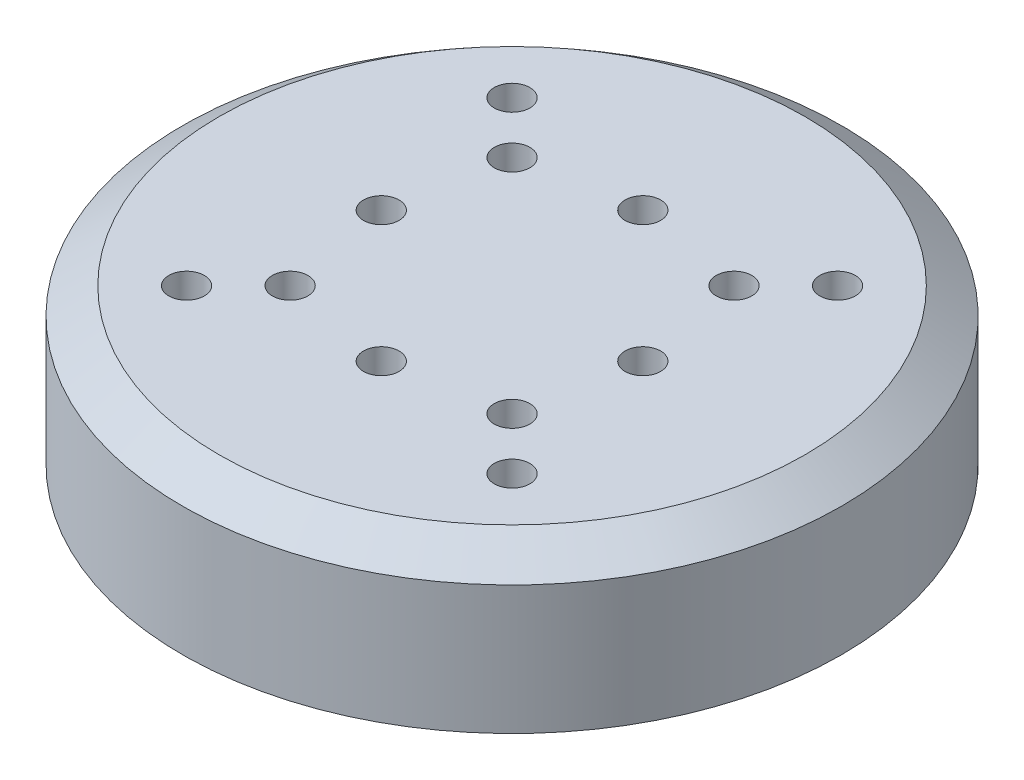
ISO-10303-21;
HEADER;
FILE_DESCRIPTION(('STEP AP214'),'2;1');
FILE_NAME('part.step','',(''),(''),'','','');
FILE_SCHEMA(('AUTOMOTIVE_DESIGN { 1 0 10303 214 1 1 1 1 }'));
ENDSEC;
DATA;
#1=APPLICATION_CONTEXT('core data for automotive mechanical design processes');
#2=APPLICATION_PROTOCOL_DEFINITION('international standard','automotive_design',2000,#1);
#3=PRODUCT_CONTEXT('',#1,'mechanical');
#4=PRODUCT('Part','Part','',(#3));
#5=PRODUCT_RELATED_PRODUCT_CATEGORY('part','',(#4));
#6=PRODUCT_DEFINITION_FORMATION('','',#4);
#7=PRODUCT_DEFINITION_CONTEXT('part definition',#1,'design');
#8=PRODUCT_DEFINITION('design','',#6,#7);
#9=PRODUCT_DEFINITION_SHAPE('','',#8);
#10=(LENGTH_UNIT() NAMED_UNIT(*) SI_UNIT(.MILLI.,.METRE.));
#11=(NAMED_UNIT(*) PLANE_ANGLE_UNIT() SI_UNIT($,.RADIAN.));
#12=(NAMED_UNIT(*) SI_UNIT($,.STERADIAN.) SOLID_ANGLE_UNIT());
#13=UNCERTAINTY_MEASURE_WITH_UNIT(LENGTH_MEASURE(1.E-05),#10,'distance_accuracy_value','');
#14=(GEOMETRIC_REPRESENTATION_CONTEXT(3) GLOBAL_UNCERTAINTY_ASSIGNED_CONTEXT((#13)) GLOBAL_UNIT_ASSIGNED_CONTEXT((#10,
#11,#12)) REPRESENTATION_CONTEXT('',''));
#15=CARTESIAN_POINT('',(0.,0.,0.));
#16=DIRECTION('',(0.,0.,1.));
#17=DIRECTION('',(1.,0.,0.));
#18=AXIS2_PLACEMENT_3D('',#15,#16,#17);
#19=CARTESIAN_POINT('',(-31.5,-7.40000000000001,0.));
#20=DIRECTION('',(0.,1.,0.));
#21=DIRECTION('',(-1.,0.,0.));
#22=AXIS2_PLACEMENT_3D('',#19,#20,#21);
#23=PLANE('',#22);
#24=CARTESIAN_POINT('',(0.,-7.4,0.));
#25=DIRECTION('',(0.,-1.,0.));
#26=DIRECTION('',(1.,0.,0.));
#27=AXIS2_PLACEMENT_3D('',#24,#25,#26);
#28=CIRCLE('',#27,29.5);
#29=CARTESIAN_POINT('',(29.5,-7.4,0.));
#30=VERTEX_POINT('',#29);
#31=EDGE_CURVE('E284',#30,#30,#28,.T.);
#32=ORIENTED_EDGE('',*,*,#31,.F.);
#33=EDGE_LOOP('',(#32));
#34=FACE_BOUND('',#33,.T.);
#35=CARTESIAN_POINT('',(0.,-7.4,0.));
#36=DIRECTION('',(0.,-1.,0.));
#37=DIRECTION('',(1.,0.,0.));
#38=AXIS2_PLACEMENT_3D('',#35,#36,#37);
#39=CIRCLE('',#38,31.5);
#40=CARTESIAN_POINT('',(31.5,-7.39999999999999,0.));
#41=VERTEX_POINT('',#40);
#42=EDGE_CURVE('E160',#41,#41,#39,.T.);
#43=ORIENTED_EDGE('',*,*,#42,.T.);
#44=EDGE_LOOP('',(#43));
#45=FACE_BOUND('',#44,.T.);
#46=ADVANCED_FACE('F33',(#34,#45),#23,.F.);
#47=CARTESIAN_POINT('',(0.,7.4,0.));
#48=DIRECTION('',(0.,-1.,0.));
#49=DIRECTION('',(1.,0.,0.));
#50=AXIS2_PLACEMENT_3D('',#47,#48,#49);
#51=PLANE('',#50);
#52=CARTESIAN_POINT('',(-15.556349186104,7.4,-15.5563491861041));
#53=DIRECTION('',(0.,1.,0.));
#54=DIRECTION('',(0.,0.,1.));
#55=AXIS2_PLACEMENT_3D('',#52,#53,#54);
#56=CIRCLE('',#55,1.69999999999999);
#57=CARTESIAN_POINT('',(-15.556349186104,7.4,-13.8563491861041));
#58=VERTEX_POINT('',#57);
#59=EDGE_CURVE('E88',#58,#58,#56,.T.);
#60=ORIENTED_EDGE('',*,*,#59,.F.);
#61=EDGE_LOOP('',(#60));
#62=FACE_BOUND('',#61,.T.);
#63=CARTESIAN_POINT('',(-10.6066017177982,7.4,-10.6066017177983));
#64=DIRECTION('',(0.,1.,0.));
#65=DIRECTION('',(0.,0.,1.));
#66=AXIS2_PLACEMENT_3D('',#63,#64,#65);
#67=CIRCLE('',#66,1.69999999999999);
#68=CARTESIAN_POINT('',(-10.6066017177982,7.4,-8.90660171779828));
#69=VERTEX_POINT('',#68);
#70=EDGE_CURVE('E87',#69,#69,#67,.T.);
#71=ORIENTED_EDGE('',*,*,#70,.F.);
#72=EDGE_LOOP('',(#71));
#73=FACE_BOUND('',#72,.T.);
#74=CARTESIAN_POINT('',(0.,7.4,-12.5));
#75=DIRECTION('',(0.,1.,0.));
#76=DIRECTION('',(0.,0.,1.));
#77=AXIS2_PLACEMENT_3D('',#74,#75,#76);
#78=CIRCLE('',#77,1.69999999999999);
#79=CARTESIAN_POINT('',(0.,7.4,-10.8));
#80=VERTEX_POINT('',#79);
#81=EDGE_CURVE('E100',#80,#80,#78,.T.);
#82=ORIENTED_EDGE('',*,*,#81,.F.);
#83=EDGE_LOOP('',(#82));
#84=FACE_BOUND('',#83,.T.);
#85=CARTESIAN_POINT('',(10.6066017177983,7.40000000000001,-10.6066017177982));
#86=DIRECTION('',(0.,1.,0.));
#87=DIRECTION('',(0.,0.,1.));
#88=AXIS2_PLACEMENT_3D('',#85,#86,#87);
#89=CIRCLE('',#88,1.69999999999999);
#90=CARTESIAN_POINT('',(10.6066017177983,7.40000000000001,-8.90660171779817));
#91=VERTEX_POINT('',#90);
#92=EDGE_CURVE('E106',#91,#91,#89,.T.);
#93=ORIENTED_EDGE('',*,*,#92,.F.);
#94=EDGE_LOOP('',(#93));
#95=FACE_BOUND('',#94,.T.);
#96=CARTESIAN_POINT('',(15.5563491861041,7.40000000000001,-15.556349186104));
#97=DIRECTION('',(0.,1.,0.));
#98=DIRECTION('',(0.,0.,1.));
#99=AXIS2_PLACEMENT_3D('',#96,#97,#98);
#100=CIRCLE('',#99,1.69999999999999);
#101=CARTESIAN_POINT('',(15.5563491861041,7.40000000000001,-13.856349186104));
#102=VERTEX_POINT('',#101);
#103=EDGE_CURVE('E112',#102,#102,#100,.T.);
#104=ORIENTED_EDGE('',*,*,#103,.F.);
#105=EDGE_LOOP('',(#104));
#106=FACE_BOUND('',#105,.T.);
#107=CARTESIAN_POINT('',(0.,7.4,12.5));
#108=DIRECTION('',(0.,1.,0.));
#109=DIRECTION('',(0.,0.,1.));
#110=AXIS2_PLACEMENT_3D('',#107,#108,#109);
#111=CIRCLE('',#110,1.69999999999999);
#112=CARTESIAN_POINT('',(0.,7.4,14.2));
#113=VERTEX_POINT('',#112);
#114=EDGE_CURVE('E118',#113,#113,#111,.T.);
#115=ORIENTED_EDGE('',*,*,#114,.F.);
#116=EDGE_LOOP('',(#115));
#117=FACE_BOUND('',#116,.T.);
#118=CARTESIAN_POINT('',(-12.5,7.4,0.));
#119=DIRECTION('',(0.,1.,0.));
#120=DIRECTION('',(0.,0.,1.));
#121=AXIS2_PLACEMENT_3D('',#118,#119,#120);
#122=CIRCLE('',#121,1.69999999999999);
#123=CARTESIAN_POINT('',(-12.5,7.4,1.69999999999999));
#124=VERTEX_POINT('',#123);
#125=EDGE_CURVE('E124',#124,#124,#122,.T.);
#126=ORIENTED_EDGE('',*,*,#125,.F.);
#127=EDGE_LOOP('',(#126));
#128=FACE_BOUND('',#127,.T.);
#129=CARTESIAN_POINT('',(12.5,7.40000000000001,0.));
#130=DIRECTION('',(0.,1.,0.));
#131=DIRECTION('',(0.,0.,1.));
#132=AXIS2_PLACEMENT_3D('',#129,#130,#131);
#133=CIRCLE('',#132,1.69999999999999);
#134=CARTESIAN_POINT('',(12.5,7.40000000000001,1.69999999999999));
#135=VERTEX_POINT('',#134);
#136=EDGE_CURVE('E130',#135,#135,#133,.T.);
#137=ORIENTED_EDGE('',*,*,#136,.F.);
#138=EDGE_LOOP('',(#137));
#139=FACE_BOUND('',#138,.T.);
#140=CARTESIAN_POINT('',(10.6066017177982,7.40000000000001,10.6066017177983));
#141=DIRECTION('',(0.,1.,0.));
#142=DIRECTION('',(0.,0.,1.));
#143=AXIS2_PLACEMENT_3D('',#140,#141,#142);
#144=CIRCLE('',#143,1.69999999999999);
#145=CARTESIAN_POINT('',(10.6066017177982,7.40000000000001,12.3066017177983));
#146=VERTEX_POINT('',#145);
#147=EDGE_CURVE('E136',#146,#146,#144,.T.);
#148=ORIENTED_EDGE('',*,*,#147,.F.);
#149=EDGE_LOOP('',(#148));
#150=FACE_BOUND('',#149,.T.);
#151=CARTESIAN_POINT('',(-10.6066017177983,7.4,10.6066017177982));
#152=DIRECTION('',(0.,1.,0.));
#153=DIRECTION('',(0.,0.,1.));
#154=AXIS2_PLACEMENT_3D('',#151,#152,#153);
#155=CIRCLE('',#154,1.69999999999999);
#156=CARTESIAN_POINT('',(-10.6066017177983,7.4,12.3066017177981));
#157=VERTEX_POINT('',#156);
#158=EDGE_CURVE('E142',#157,#157,#155,.T.);
#159=ORIENTED_EDGE('',*,*,#158,.F.);
#160=EDGE_LOOP('',(#159));
#161=FACE_BOUND('',#160,.T.);
#162=CARTESIAN_POINT('',(-15.5563491861041,7.4,15.556349186104));
#163=DIRECTION('',(0.,1.,0.));
#164=DIRECTION('',(0.,0.,1.));
#165=AXIS2_PLACEMENT_3D('',#162,#163,#164);
#166=CIRCLE('',#165,1.69999999999999);
#167=CARTESIAN_POINT('',(-15.5563491861041,7.4,17.256349186104));
#168=VERTEX_POINT('',#167);
#169=EDGE_CURVE('E148',#168,#168,#166,.T.);
#170=ORIENTED_EDGE('',*,*,#169,.F.);
#171=EDGE_LOOP('',(#170));
#172=FACE_BOUND('',#171,.T.);
#173=CARTESIAN_POINT('',(15.556349186104,7.40000000000001,15.5563491861041));
#174=DIRECTION('',(0.,1.,0.));
#175=DIRECTION('',(0.,0.,1.));
#176=AXIS2_PLACEMENT_3D('',#173,#174,#175);
#177=CIRCLE('',#176,1.69999999999999);
#178=CARTESIAN_POINT('',(15.556349186104,7.40000000000001,17.2563491861041));
#179=VERTEX_POINT('',#178);
#180=EDGE_CURVE('E154',#179,#179,#177,.T.);
#181=ORIENTED_EDGE('',*,*,#180,.F.);
#182=EDGE_LOOP('',(#181));
#183=FACE_BOUND('',#182,.T.);
#184=CARTESIAN_POINT('',(0.,7.4,0.));
#185=DIRECTION('',(0.,-1.,0.));
#186=DIRECTION('',(1.,0.,0.));
#187=AXIS2_PLACEMENT_3D('',#184,#185,#186);
#188=CIRCLE('',#187,28.);
#189=CARTESIAN_POINT('',(28.,7.4,0.));
#190=VERTEX_POINT('',#189);
#191=EDGE_CURVE('E11',#190,#190,#188,.T.);
#192=ORIENTED_EDGE('',*,*,#191,.F.);
#193=EDGE_LOOP('',(#192));
#194=FACE_BOUND('',#193,.T.);
#195=ADVANCED_FACE('F170',(#62,#73,#84,#95,#106,#117,#128,#139,#150,#161,#172,#183,#194),#51,.F.);
#196=CARTESIAN_POINT('',(0.,7.4,0.));
#197=DIRECTION('',(0.,-1.,0.));
#198=DIRECTION('',(1.,0.,0.));
#199=AXIS2_PLACEMENT_3D('',#196,#197,#198);
#200=CONICAL_SURFACE('',#199,28.,0.950546840812075);
#201=CARTESIAN_POINT('',(0.,4.9,0.));
#202=DIRECTION('',(0.,-1.,0.));
#203=DIRECTION('',(1.,0.,0.));
#204=AXIS2_PLACEMENT_3D('',#201,#202,#203);
#205=CIRCLE('',#204,31.5);
#206=CARTESIAN_POINT('',(31.5,4.90000000000001,0.));
#207=VERTEX_POINT('',#206);
#208=EDGE_CURVE('E40',#207,#207,#205,.T.);
#209=ORIENTED_EDGE('',*,*,#208,.F.);
#210=EDGE_LOOP('',(#209));
#211=FACE_BOUND('',#210,.T.);
#212=ORIENTED_EDGE('',*,*,#191,.T.);
#213=EDGE_LOOP('',(#212));
#214=FACE_BOUND('',#213,.T.);
#215=ADVANCED_FACE('F167',(#211,#214),#200,.T.);
#216=CARTESIAN_POINT('',(0.,-7.40000000000001,0.));
#217=DIRECTION('',(0.,-1.,0.));
#218=DIRECTION('',(1.,0.,0.));
#219=AXIS2_PLACEMENT_3D('',#216,#217,#218);
#220=CYLINDRICAL_SURFACE('',#219,31.5);
#221=ORIENTED_EDGE('',*,*,#42,.F.);
#222=EDGE_LOOP('',(#221));
#223=FACE_BOUND('',#222,.T.);
#224=ORIENTED_EDGE('',*,*,#208,.T.);
#225=EDGE_LOOP('',(#224));
#226=FACE_BOUND('',#225,.T.);
#227=ADVANCED_FACE('F165',(#223,#226),#220,.T.);
#228=CARTESIAN_POINT('',(15.556349186104,3.4,15.5563491861041));
#229=DIRECTION('',(0.,1.,0.));
#230=DIRECTION('',(0.,0.,1.));
#231=AXIS2_PLACEMENT_3D('',#228,#229,#230);
#232=CONICAL_SURFACE('',#231,1.69999999999999,1.02974425867665);
#233=CARTESIAN_POINT('',(15.556349186104,2.37853694765315,15.5563491861041));
#234=VERTEX_POINT('',#233);
#235=VERTEX_LOOP('',#234);
#236=FACE_BOUND('',#235,.T.);
#237=CARTESIAN_POINT('',(15.556349186104,3.4,15.5563491861041));
#238=DIRECTION('',(0.,1.,0.));
#239=DIRECTION('',(0.,0.,1.));
#240=AXIS2_PLACEMENT_3D('',#237,#238,#239);
#241=CIRCLE('',#240,1.69999999999999);
#242=CARTESIAN_POINT('',(15.556349186104,3.4,17.2563491861041));
#243=VERTEX_POINT('',#242);
#244=EDGE_CURVE('E157',#243,#243,#241,.T.);
#245=ORIENTED_EDGE('',*,*,#244,.T.);
#246=EDGE_LOOP('',(#245));
#247=FACE_BOUND('',#246,.T.);
#248=ADVANCED_FACE('F185',(#236,#247),#232,.F.);
#249=CARTESIAN_POINT('',(15.556349186104,7.40000000000001,15.5563491861041));
#250=DIRECTION('',(0.,1.,0.));
#251=DIRECTION('',(0.,0.,1.));
#252=AXIS2_PLACEMENT_3D('',#249,#250,#251);
#253=CYLINDRICAL_SURFACE('',#252,1.69999999999999);
#254=ORIENTED_EDGE('',*,*,#244,.F.);
#255=EDGE_LOOP('',(#254));
#256=FACE_BOUND('',#255,.T.);
#257=ORIENTED_EDGE('',*,*,#180,.T.);
#258=EDGE_LOOP('',(#257));
#259=FACE_BOUND('',#258,.T.);
#260=ADVANCED_FACE('F189',(#256,#259),#253,.F.);
#261=CARTESIAN_POINT('',(-15.5563491861041,3.4,15.556349186104));
#262=DIRECTION('',(0.,1.,0.));
#263=DIRECTION('',(0.,0.,1.));
#264=AXIS2_PLACEMENT_3D('',#261,#262,#263);
#265=CONICAL_SURFACE('',#264,1.69999999999999,1.02974425867665);
#266=CARTESIAN_POINT('',(-15.5563491861041,2.37853694765315,15.556349186104));
#267=VERTEX_POINT('',#266);
#268=VERTEX_LOOP('',#267);
#269=FACE_BOUND('',#268,.T.);
#270=CARTESIAN_POINT('',(-15.5563491861041,3.4,15.556349186104));
#271=DIRECTION('',(0.,1.,0.));
#272=DIRECTION('',(0.,0.,1.));
#273=AXIS2_PLACEMENT_3D('',#270,#271,#272);
#274=CIRCLE('',#273,1.69999999999999);
#275=CARTESIAN_POINT('',(-15.5563491861041,3.4,17.256349186104));
#276=VERTEX_POINT('',#275);
#277=EDGE_CURVE('E151',#276,#276,#274,.T.);
#278=ORIENTED_EDGE('',*,*,#277,.T.);
#279=EDGE_LOOP('',(#278));
#280=FACE_BOUND('',#279,.T.);
#281=ADVANCED_FACE('F192',(#269,#280),#265,.F.);
#282=CARTESIAN_POINT('',(-15.5563491861041,7.4,15.556349186104));
#283=DIRECTION('',(0.,1.,0.));
#284=DIRECTION('',(0.,0.,1.));
#285=AXIS2_PLACEMENT_3D('',#282,#283,#284);
#286=CYLINDRICAL_SURFACE('',#285,1.69999999999999);
#287=ORIENTED_EDGE('',*,*,#277,.F.);
#288=EDGE_LOOP('',(#287));
#289=FACE_BOUND('',#288,.T.);
#290=ORIENTED_EDGE('',*,*,#169,.T.);
#291=EDGE_LOOP('',(#290));
#292=FACE_BOUND('',#291,.T.);
#293=ADVANCED_FACE('F196',(#289,#292),#286,.F.);
#294=CARTESIAN_POINT('',(-10.6066017177983,3.4,10.6066017177982));
#295=DIRECTION('',(0.,1.,0.));
#296=DIRECTION('',(0.,0.,1.));
#297=AXIS2_PLACEMENT_3D('',#294,#295,#296);
#298=CONICAL_SURFACE('',#297,1.69999999999999,1.02974425867665);
#299=CARTESIAN_POINT('',(-10.6066017177983,2.37853694765315,10.6066017177982));
#300=VERTEX_POINT('',#299);
#301=VERTEX_LOOP('',#300);
#302=FACE_BOUND('',#301,.T.);
#303=CARTESIAN_POINT('',(-10.6066017177983,3.4,10.6066017177982));
#304=DIRECTION('',(0.,1.,0.));
#305=DIRECTION('',(0.,0.,1.));
#306=AXIS2_PLACEMENT_3D('',#303,#304,#305);
#307=CIRCLE('',#306,1.69999999999999);
#308=CARTESIAN_POINT('',(-10.6066017177983,3.4,12.3066017177981));
#309=VERTEX_POINT('',#308);
#310=EDGE_CURVE('E145',#309,#309,#307,.T.);
#311=ORIENTED_EDGE('',*,*,#310,.T.);
#312=EDGE_LOOP('',(#311));
#313=FACE_BOUND('',#312,.T.);
#314=ADVANCED_FACE('F199',(#302,#313),#298,.F.);
#315=CARTESIAN_POINT('',(-10.6066017177983,7.4,10.6066017177982));
#316=DIRECTION('',(0.,1.,0.));
#317=DIRECTION('',(0.,0.,1.));
#318=AXIS2_PLACEMENT_3D('',#315,#316,#317);
#319=CYLINDRICAL_SURFACE('',#318,1.69999999999999);
#320=ORIENTED_EDGE('',*,*,#310,.F.);
#321=EDGE_LOOP('',(#320));
#322=FACE_BOUND('',#321,.T.);
#323=ORIENTED_EDGE('',*,*,#158,.T.);
#324=EDGE_LOOP('',(#323));
#325=FACE_BOUND('',#324,.T.);
#326=ADVANCED_FACE('F203',(#322,#325),#319,.F.);
#327=CARTESIAN_POINT('',(10.6066017177982,3.4,10.6066017177983));
#328=DIRECTION('',(0.,1.,0.));
#329=DIRECTION('',(0.,0.,1.));
#330=AXIS2_PLACEMENT_3D('',#327,#328,#329);
#331=CONICAL_SURFACE('',#330,1.69999999999999,1.02974425867665);
#332=CARTESIAN_POINT('',(10.6066017177982,2.37853694765315,10.6066017177983));
#333=VERTEX_POINT('',#332);
#334=VERTEX_LOOP('',#333);
#335=FACE_BOUND('',#334,.T.);
#336=CARTESIAN_POINT('',(10.6066017177982,3.4,10.6066017177983));
#337=DIRECTION('',(0.,1.,0.));
#338=DIRECTION('',(0.,0.,1.));
#339=AXIS2_PLACEMENT_3D('',#336,#337,#338);
#340=CIRCLE('',#339,1.69999999999999);
#341=CARTESIAN_POINT('',(10.6066017177982,3.4,12.3066017177983));
#342=VERTEX_POINT('',#341);
#343=EDGE_CURVE('E139',#342,#342,#340,.T.);
#344=ORIENTED_EDGE('',*,*,#343,.T.);
#345=EDGE_LOOP('',(#344));
#346=FACE_BOUND('',#345,.T.);
#347=ADVANCED_FACE('F207',(#335,#346),#331,.F.);
#348=CARTESIAN_POINT('',(10.6066017177982,7.4,10.6066017177983));
#349=DIRECTION('',(0.,1.,0.));
#350=DIRECTION('',(0.,0.,1.));
#351=AXIS2_PLACEMENT_3D('',#348,#349,#350);
#352=CYLINDRICAL_SURFACE('',#351,1.69999999999999);
#353=ORIENTED_EDGE('',*,*,#343,.F.);
#354=EDGE_LOOP('',(#353));
#355=FACE_BOUND('',#354,.T.);
#356=ORIENTED_EDGE('',*,*,#147,.T.);
#357=EDGE_LOOP('',(#356));
#358=FACE_BOUND('',#357,.T.);
#359=ADVANCED_FACE('F211',(#355,#358),#352,.F.);
#360=CARTESIAN_POINT('',(12.5,3.4,0.));
#361=DIRECTION('',(0.,1.,0.));
#362=DIRECTION('',(0.,0.,1.));
#363=AXIS2_PLACEMENT_3D('',#360,#361,#362);
#364=CONICAL_SURFACE('',#363,1.69999999999999,1.02974425867665);
#365=CARTESIAN_POINT('',(12.5,2.37853694765315,0.));
#366=VERTEX_POINT('',#365);
#367=VERTEX_LOOP('',#366);
#368=FACE_BOUND('',#367,.T.);
#369=CARTESIAN_POINT('',(12.5,3.4,0.));
#370=DIRECTION('',(0.,1.,0.));
#371=DIRECTION('',(0.,0.,1.));
#372=AXIS2_PLACEMENT_3D('',#369,#370,#371);
#373=CIRCLE('',#372,1.69999999999999);
#374=CARTESIAN_POINT('',(12.5,3.4,1.69999999999999));
#375=VERTEX_POINT('',#374);
#376=EDGE_CURVE('E133',#375,#375,#373,.T.);
#377=ORIENTED_EDGE('',*,*,#376,.T.);
#378=EDGE_LOOP('',(#377));
#379=FACE_BOUND('',#378,.T.);
#380=ADVANCED_FACE('F215',(#368,#379),#364,.F.);
#381=CARTESIAN_POINT('',(12.5,7.40000000000001,0.));
#382=DIRECTION('',(0.,1.,0.));
#383=DIRECTION('',(0.,0.,1.));
#384=AXIS2_PLACEMENT_3D('',#381,#382,#383);
#385=CYLINDRICAL_SURFACE('',#384,1.69999999999999);
#386=ORIENTED_EDGE('',*,*,#376,.F.);
#387=EDGE_LOOP('',(#386));
#388=FACE_BOUND('',#387,.T.);
#389=ORIENTED_EDGE('',*,*,#136,.T.);
#390=EDGE_LOOP('',(#389));
#391=FACE_BOUND('',#390,.T.);
#392=ADVANCED_FACE('F219',(#388,#391),#385,.F.);
#393=CARTESIAN_POINT('',(-12.5,3.4,0.));
#394=DIRECTION('',(0.,1.,0.));
#395=DIRECTION('',(0.,0.,1.));
#396=AXIS2_PLACEMENT_3D('',#393,#394,#395);
#397=CONICAL_SURFACE('',#396,1.69999999999999,1.02974425867665);
#398=CARTESIAN_POINT('',(-12.5,2.37853694765315,0.));
#399=VERTEX_POINT('',#398);
#400=VERTEX_LOOP('',#399);
#401=FACE_BOUND('',#400,.T.);
#402=CARTESIAN_POINT('',(-12.5,3.4,0.));
#403=DIRECTION('',(0.,1.,0.));
#404=DIRECTION('',(0.,0.,1.));
#405=AXIS2_PLACEMENT_3D('',#402,#403,#404);
#406=CIRCLE('',#405,1.69999999999999);
#407=CARTESIAN_POINT('',(-12.5,3.4,1.69999999999999));
#408=VERTEX_POINT('',#407);
#409=EDGE_CURVE('E127',#408,#408,#406,.T.);
#410=ORIENTED_EDGE('',*,*,#409,.T.);
#411=EDGE_LOOP('',(#410));
#412=FACE_BOUND('',#411,.T.);
#413=ADVANCED_FACE('F223',(#401,#412),#397,.F.);
#414=CARTESIAN_POINT('',(-12.5,7.4,0.));
#415=DIRECTION('',(0.,1.,0.));
#416=DIRECTION('',(0.,0.,1.));
#417=AXIS2_PLACEMENT_3D('',#414,#415,#416);
#418=CYLINDRICAL_SURFACE('',#417,1.69999999999999);
#419=ORIENTED_EDGE('',*,*,#409,.F.);
#420=EDGE_LOOP('',(#419));
#421=FACE_BOUND('',#420,.T.);
#422=ORIENTED_EDGE('',*,*,#125,.T.);
#423=EDGE_LOOP('',(#422));
#424=FACE_BOUND('',#423,.T.);
#425=ADVANCED_FACE('F227',(#421,#424),#418,.F.);
#426=CARTESIAN_POINT('',(0.,3.4,12.5));
#427=DIRECTION('',(0.,1.,0.));
#428=DIRECTION('',(0.,0.,1.));
#429=AXIS2_PLACEMENT_3D('',#426,#427,#428);
#430=CONICAL_SURFACE('',#429,1.69999999999999,1.02974425867665);
#431=CARTESIAN_POINT('',(0.,2.37853694765315,12.5));
#432=VERTEX_POINT('',#431);
#433=VERTEX_LOOP('',#432);
#434=FACE_BOUND('',#433,.T.);
#435=CARTESIAN_POINT('',(0.,3.4,12.5));
#436=DIRECTION('',(0.,1.,0.));
#437=DIRECTION('',(0.,0.,1.));
#438=AXIS2_PLACEMENT_3D('',#435,#436,#437);
#439=CIRCLE('',#438,1.69999999999999);
#440=CARTESIAN_POINT('',(0.,3.4,14.2));
#441=VERTEX_POINT('',#440);
#442=EDGE_CURVE('E121',#441,#441,#439,.T.);
#443=ORIENTED_EDGE('',*,*,#442,.T.);
#444=EDGE_LOOP('',(#443));
#445=FACE_BOUND('',#444,.T.);
#446=ADVANCED_FACE('F231',(#434,#445),#430,.F.);
#447=CARTESIAN_POINT('',(0.,7.4,12.5));
#448=DIRECTION('',(0.,1.,0.));
#449=DIRECTION('',(0.,0.,1.));
#450=AXIS2_PLACEMENT_3D('',#447,#448,#449);
#451=CYLINDRICAL_SURFACE('',#450,1.69999999999999);
#452=ORIENTED_EDGE('',*,*,#442,.F.);
#453=EDGE_LOOP('',(#452));
#454=FACE_BOUND('',#453,.T.);
#455=ORIENTED_EDGE('',*,*,#114,.T.);
#456=EDGE_LOOP('',(#455));
#457=FACE_BOUND('',#456,.T.);
#458=ADVANCED_FACE('F235',(#454,#457),#451,.F.);
#459=CARTESIAN_POINT('',(15.5563491861041,3.4,-15.556349186104));
#460=DIRECTION('',(0.,1.,0.));
#461=DIRECTION('',(0.,0.,1.));
#462=AXIS2_PLACEMENT_3D('',#459,#460,#461);
#463=CONICAL_SURFACE('',#462,1.69999999999999,1.02974425867665);
#464=CARTESIAN_POINT('',(15.5563491861041,2.37853694765315,-15.556349186104));
#465=VERTEX_POINT('',#464);
#466=VERTEX_LOOP('',#465);
#467=FACE_BOUND('',#466,.T.);
#468=CARTESIAN_POINT('',(15.5563491861041,3.4,-15.556349186104));
#469=DIRECTION('',(0.,1.,0.));
#470=DIRECTION('',(0.,0.,1.));
#471=AXIS2_PLACEMENT_3D('',#468,#469,#470);
#472=CIRCLE('',#471,1.69999999999999);
#473=CARTESIAN_POINT('',(15.5563491861041,3.4,-13.856349186104));
#474=VERTEX_POINT('',#473);
#475=EDGE_CURVE('E115',#474,#474,#472,.T.);
#476=ORIENTED_EDGE('',*,*,#475,.T.);
#477=EDGE_LOOP('',(#476));
#478=FACE_BOUND('',#477,.T.);
#479=ADVANCED_FACE('F239',(#467,#478),#463,.F.);
#480=CARTESIAN_POINT('',(15.5563491861041,7.40000000000001,-15.556349186104));
#481=DIRECTION('',(0.,1.,0.));
#482=DIRECTION('',(0.,0.,1.));
#483=AXIS2_PLACEMENT_3D('',#480,#481,#482);
#484=CYLINDRICAL_SURFACE('',#483,1.69999999999999);
#485=ORIENTED_EDGE('',*,*,#475,.F.);
#486=EDGE_LOOP('',(#485));
#487=FACE_BOUND('',#486,.T.);
#488=ORIENTED_EDGE('',*,*,#103,.T.);
#489=EDGE_LOOP('',(#488));
#490=FACE_BOUND('',#489,.T.);
#491=ADVANCED_FACE('F243',(#487,#490),#484,.F.);
#492=CARTESIAN_POINT('',(10.6066017177983,3.4,-10.6066017177982));
#493=DIRECTION('',(0.,1.,0.));
#494=DIRECTION('',(0.,0.,1.));
#495=AXIS2_PLACEMENT_3D('',#492,#493,#494);
#496=CONICAL_SURFACE('',#495,1.69999999999999,1.02974425867665);
#497=CARTESIAN_POINT('',(10.6066017177983,2.37853694765315,-10.6066017177982));
#498=VERTEX_POINT('',#497);
#499=VERTEX_LOOP('',#498);
#500=FACE_BOUND('',#499,.T.);
#501=CARTESIAN_POINT('',(10.6066017177983,3.4,-10.6066017177982));
#502=DIRECTION('',(0.,1.,0.));
#503=DIRECTION('',(0.,0.,1.));
#504=AXIS2_PLACEMENT_3D('',#501,#502,#503);
#505=CIRCLE('',#504,1.69999999999999);
#506=CARTESIAN_POINT('',(10.6066017177983,3.4,-8.90660171779818));
#507=VERTEX_POINT('',#506);
#508=EDGE_CURVE('E109',#507,#507,#505,.T.);
#509=ORIENTED_EDGE('',*,*,#508,.T.);
#510=EDGE_LOOP('',(#509));
#511=FACE_BOUND('',#510,.T.);
#512=ADVANCED_FACE('F247',(#500,#511),#496,.F.);
#513=CARTESIAN_POINT('',(10.6066017177983,7.4,-10.6066017177982));
#514=DIRECTION('',(0.,1.,0.));
#515=DIRECTION('',(0.,0.,1.));
#516=AXIS2_PLACEMENT_3D('',#513,#514,#515);
#517=CYLINDRICAL_SURFACE('',#516,1.69999999999999);
#518=ORIENTED_EDGE('',*,*,#508,.F.);
#519=EDGE_LOOP('',(#518));
#520=FACE_BOUND('',#519,.T.);
#521=ORIENTED_EDGE('',*,*,#92,.T.);
#522=EDGE_LOOP('',(#521));
#523=FACE_BOUND('',#522,.T.);
#524=ADVANCED_FACE('F251',(#520,#523),#517,.F.);
#525=CARTESIAN_POINT('',(0.,3.4,-12.5));
#526=DIRECTION('',(0.,1.,0.));
#527=DIRECTION('',(0.,0.,1.));
#528=AXIS2_PLACEMENT_3D('',#525,#526,#527);
#529=CONICAL_SURFACE('',#528,1.69999999999999,1.02974425867665);
#530=CARTESIAN_POINT('',(0.,2.37853694765315,-12.5));
#531=VERTEX_POINT('',#530);
#532=VERTEX_LOOP('',#531);
#533=FACE_BOUND('',#532,.T.);
#534=CARTESIAN_POINT('',(0.,3.4,-12.5));
#535=DIRECTION('',(0.,1.,0.));
#536=DIRECTION('',(0.,0.,1.));
#537=AXIS2_PLACEMENT_3D('',#534,#535,#536);
#538=CIRCLE('',#537,1.69999999999999);
#539=CARTESIAN_POINT('',(0.,3.4,-10.8));
#540=VERTEX_POINT('',#539);
#541=EDGE_CURVE('E103',#540,#540,#538,.T.);
#542=ORIENTED_EDGE('',*,*,#541,.T.);
#543=EDGE_LOOP('',(#542));
#544=FACE_BOUND('',#543,.T.);
#545=ADVANCED_FACE('F255',(#533,#544),#529,.F.);
#546=CARTESIAN_POINT('',(0.,7.4,-12.5));
#547=DIRECTION('',(0.,1.,0.));
#548=DIRECTION('',(0.,0.,1.));
#549=AXIS2_PLACEMENT_3D('',#546,#547,#548);
#550=CYLINDRICAL_SURFACE('',#549,1.69999999999999);
#551=ORIENTED_EDGE('',*,*,#541,.F.);
#552=EDGE_LOOP('',(#551));
#553=FACE_BOUND('',#552,.T.);
#554=ORIENTED_EDGE('',*,*,#81,.T.);
#555=EDGE_LOOP('',(#554));
#556=FACE_BOUND('',#555,.T.);
#557=ADVANCED_FACE('F259',(#553,#556),#550,.F.);
#558=CARTESIAN_POINT('',(-10.6066017177982,3.4,-10.6066017177983));
#559=DIRECTION('',(0.,1.,0.));
#560=DIRECTION('',(0.,0.,1.));
#561=AXIS2_PLACEMENT_3D('',#558,#559,#560);
#562=CONICAL_SURFACE('',#561,1.69999999999999,1.02974425867665);
#563=CARTESIAN_POINT('',(-10.6066017177982,2.37853694765315,-10.6066017177983));
#564=VERTEX_POINT('',#563);
#565=VERTEX_LOOP('',#564);
#566=FACE_BOUND('',#565,.T.);
#567=CARTESIAN_POINT('',(-10.6066017177982,3.4,-10.6066017177983));
#568=DIRECTION('',(0.,1.,0.));
#569=DIRECTION('',(0.,0.,1.));
#570=AXIS2_PLACEMENT_3D('',#567,#568,#569);
#571=CIRCLE('',#570,1.69999999999999);
#572=CARTESIAN_POINT('',(-10.6066017177982,3.4,-8.90660171779828));
#573=VERTEX_POINT('',#572);
#574=EDGE_CURVE('E91',#573,#573,#571,.T.);
#575=ORIENTED_EDGE('',*,*,#574,.T.);
#576=EDGE_LOOP('',(#575));
#577=FACE_BOUND('',#576,.T.);
#578=ADVANCED_FACE('F263',(#566,#577),#562,.F.);
#579=CARTESIAN_POINT('',(-10.6066017177982,7.4,-10.6066017177983));
#580=DIRECTION('',(0.,1.,0.));
#581=DIRECTION('',(0.,0.,1.));
#582=AXIS2_PLACEMENT_3D('',#579,#580,#581);
#583=CYLINDRICAL_SURFACE('',#582,1.69999999999999);
#584=ORIENTED_EDGE('',*,*,#574,.F.);
#585=EDGE_LOOP('',(#584));
#586=FACE_BOUND('',#585,.T.);
#587=ORIENTED_EDGE('',*,*,#70,.T.);
#588=EDGE_LOOP('',(#587));
#589=FACE_BOUND('',#588,.T.);
#590=ADVANCED_FACE('F81',(#586,#589),#583,.F.);
#591=CARTESIAN_POINT('',(-15.556349186104,3.4,-15.5563491861041));
#592=DIRECTION('',(0.,1.,0.));
#593=DIRECTION('',(0.,0.,1.));
#594=AXIS2_PLACEMENT_3D('',#591,#592,#593);
#595=CONICAL_SURFACE('',#594,1.69999999999999,1.02974425867665);
#596=CARTESIAN_POINT('',(-15.556349186104,2.37853694765315,-15.5563491861041));
#597=VERTEX_POINT('',#596);
#598=VERTEX_LOOP('',#597);
#599=FACE_BOUND('',#598,.T.);
#600=CARTESIAN_POINT('',(-15.556349186104,3.4,-15.5563491861041));
#601=DIRECTION('',(0.,1.,0.));
#602=DIRECTION('',(0.,0.,1.));
#603=AXIS2_PLACEMENT_3D('',#600,#601,#602);
#604=CIRCLE('',#603,1.69999999999999);
#605=CARTESIAN_POINT('',(-15.556349186104,3.4,-13.8563491861041));
#606=VERTEX_POINT('',#605);
#607=EDGE_CURVE('E85',#606,#606,#604,.T.);
#608=ORIENTED_EDGE('',*,*,#607,.T.);
#609=EDGE_LOOP('',(#608));
#610=FACE_BOUND('',#609,.T.);
#611=ADVANCED_FACE('F77',(#599,#610),#595,.F.);
#612=CARTESIAN_POINT('',(-15.556349186104,7.4,-15.5563491861041));
#613=DIRECTION('',(0.,1.,0.));
#614=DIRECTION('',(0.,0.,1.));
#615=AXIS2_PLACEMENT_3D('',#612,#613,#614);
#616=CYLINDRICAL_SURFACE('',#615,1.69999999999999);
#617=ORIENTED_EDGE('',*,*,#607,.F.);
#618=EDGE_LOOP('',(#617));
#619=FACE_BOUND('',#618,.T.);
#620=ORIENTED_EDGE('',*,*,#59,.T.);
#621=EDGE_LOOP('',(#620));
#622=FACE_BOUND('',#621,.T.);
#623=ADVANCED_FACE('F80',(#619,#622),#616,.F.);
#624=CARTESIAN_POINT('',(0.,-6.4,0.));
#625=DIRECTION('',(0.,-1.,0.));
#626=DIRECTION('',(1.,0.,0.));
#627=AXIS2_PLACEMENT_3D('',#624,#625,#626);
#628=CYLINDRICAL_SURFACE('',#627,29.5);
#629=CARTESIAN_POINT('',(0.,-6.4,0.));
#630=DIRECTION('',(0.,-1.,0.));
#631=DIRECTION('',(1.,0.,0.));
#632=AXIS2_PLACEMENT_3D('',#629,#630,#631);
#633=CIRCLE('',#632,29.5);
#634=CARTESIAN_POINT('',(29.5,-6.4,0.));
#635=VERTEX_POINT('',#634);
#636=EDGE_CURVE('E94',#635,#635,#633,.T.);
#637=ORIENTED_EDGE('',*,*,#636,.F.);
#638=EDGE_LOOP('',(#637));
#639=FACE_BOUND('',#638,.T.);
#640=ORIENTED_EDGE('',*,*,#31,.T.);
#641=EDGE_LOOP('',(#640));
#642=FACE_BOUND('',#641,.T.);
#643=ADVANCED_FACE('F273',(#639,#642),#628,.F.);
#644=CARTESIAN_POINT('',(0.,-6.4,0.));
#645=DIRECTION('',(0.,-1.,0.));
#646=DIRECTION('',(1.,0.,0.));
#647=AXIS2_PLACEMENT_3D('',#644,#645,#646);
#648=PLANE('',#647);
#649=ORIENTED_EDGE('',*,*,#636,.T.);
#650=EDGE_LOOP('',(#649));
#651=FACE_BOUND('',#650,.T.);
#652=ADVANCED_FACE('F276',(#651),#648,.T.);
#653=CLOSED_SHELL('',(#46,#195,#215,#227,#248,#260,#281,#293,#314,#326,#347,#359,#380,#392,#413,
#425,#446,#458,#479,#491,#512,#524,#545,#557,#578,#590,#611,#623,#643,#652));
#654=MANIFOLD_SOLID_BREP('B2',#653);
#655=ADVANCED_BREP_SHAPE_REPRESENTATION('',(#18,#654),#14);
#656=SHAPE_DEFINITION_REPRESENTATION(#9,#655);
ENDSEC;
END-ISO-10303-21;
